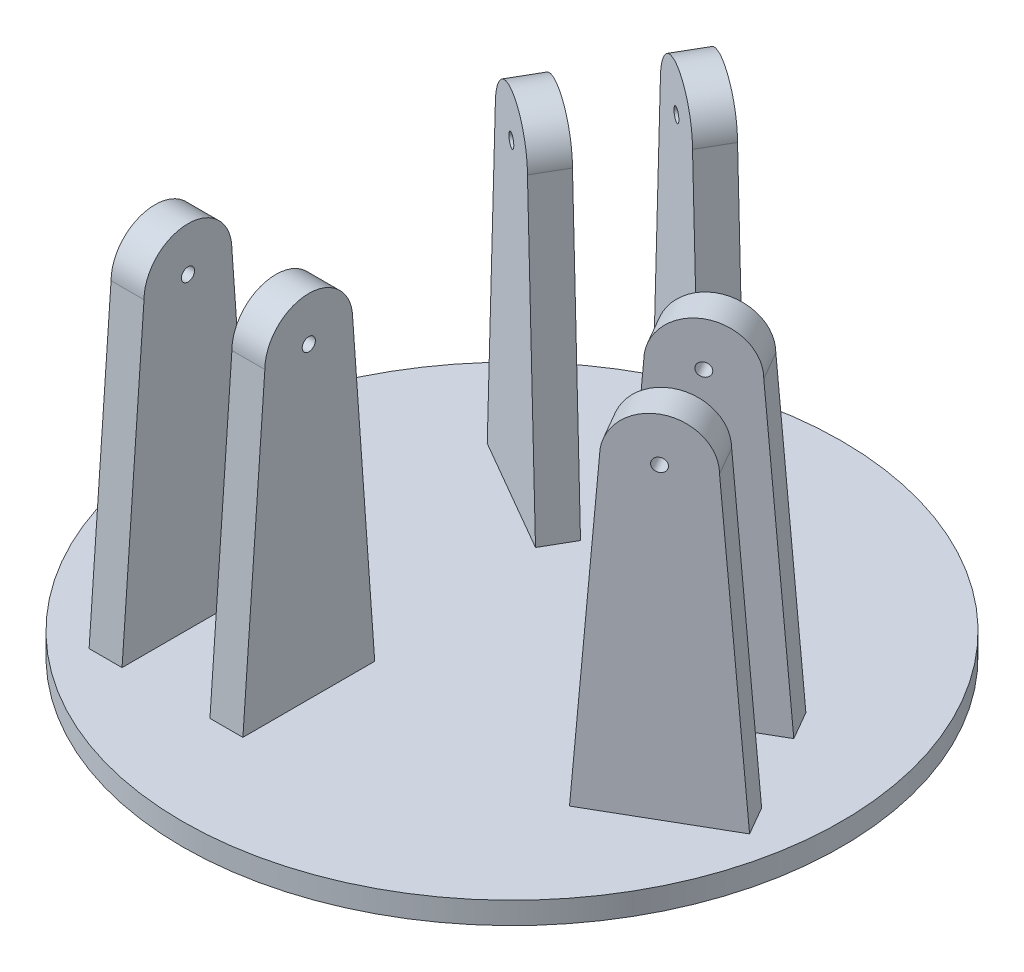
ISO-10303-21;
HEADER;
FILE_DESCRIPTION(('STEP AP214'),'2;1');
FILE_NAME('part.step','',(''),(''),'','','');
FILE_SCHEMA(('AUTOMOTIVE_DESIGN { 1 0 10303 214 1 1 1 1 }'));
ENDSEC;
DATA;
#1=APPLICATION_CONTEXT('core data for automotive mechanical design processes');
#2=APPLICATION_PROTOCOL_DEFINITION('international standard','automotive_design',2000,#1);
#3=PRODUCT_CONTEXT('',#1,'mechanical');
#4=PRODUCT('Part','Part','',(#3));
#5=PRODUCT_RELATED_PRODUCT_CATEGORY('part','',(#4));
#6=PRODUCT_DEFINITION_FORMATION('','',#4);
#7=PRODUCT_DEFINITION_CONTEXT('part definition',#1,'design');
#8=PRODUCT_DEFINITION('design','',#6,#7);
#9=PRODUCT_DEFINITION_SHAPE('','',#8);
#10=(LENGTH_UNIT() NAMED_UNIT(*) SI_UNIT(.MILLI.,.METRE.));
#11=(NAMED_UNIT(*) PLANE_ANGLE_UNIT() SI_UNIT($,.RADIAN.));
#12=(NAMED_UNIT(*) SI_UNIT($,.STERADIAN.) SOLID_ANGLE_UNIT());
#13=UNCERTAINTY_MEASURE_WITH_UNIT(LENGTH_MEASURE(1.E-05),#10,'distance_accuracy_value','');
#14=(GEOMETRIC_REPRESENTATION_CONTEXT(3) GLOBAL_UNCERTAINTY_ASSIGNED_CONTEXT((#13)) GLOBAL_UNIT_ASSIGNED_CONTEXT((#10,
#11,#12)) REPRESENTATION_CONTEXT('',''));
#15=CARTESIAN_POINT('',(0.,0.,0.));
#16=DIRECTION('',(0.,0.,1.));
#17=DIRECTION('',(1.,0.,0.));
#18=AXIS2_PLACEMENT_3D('',#15,#16,#17);
#19=CARTESIAN_POINT('',(0.,5.,0.));
#20=DIRECTION('',(0.,-1.,0.));
#21=DIRECTION('',(0.,0.,-1.));
#22=AXIS2_PLACEMENT_3D('',#19,#20,#21);
#23=CYLINDRICAL_SURFACE('',#22,75.);
#24=CARTESIAN_POINT('',(0.,5.,0.));
#25=DIRECTION('',(0.,1.,0.));
#26=DIRECTION('',(0.,0.,1.));
#27=AXIS2_PLACEMENT_3D('',#24,#25,#26);
#28=CIRCLE('',#27,75.);
#29=CARTESIAN_POINT('',(0.,5.,75.));
#30=VERTEX_POINT('',#29);
#31=EDGE_CURVE('E328',#30,#30,#28,.T.);
#32=ORIENTED_EDGE('',*,*,#31,.F.);
#33=EDGE_LOOP('',(#32));
#34=FACE_BOUND('',#33,.T.);
#35=CARTESIAN_POINT('',(0.,0.,0.));
#36=DIRECTION('',(0.,1.,0.));
#37=DIRECTION('',(0.,0.,1.));
#38=AXIS2_PLACEMENT_3D('',#35,#36,#37);
#39=CIRCLE('',#38,75.);
#40=CARTESIAN_POINT('',(0.,0.,75.));
#41=VERTEX_POINT('',#40);
#42=EDGE_CURVE('E327',#41,#41,#39,.T.);
#43=ORIENTED_EDGE('',*,*,#42,.T.);
#44=EDGE_LOOP('',(#43));
#45=FACE_BOUND('',#44,.T.);
#46=ADVANCED_FACE('F31',(#34,#45),#23,.T.);
#47=CARTESIAN_POINT('',(0.,5.,0.));
#48=DIRECTION('',(0.,1.,0.));
#49=DIRECTION('',(0.,0.,1.));
#50=AXIS2_PLACEMENT_3D('',#47,#48,#49);
#51=PLANE('',#50);
#52=DIRECTION('',(0.499999999999992,0.,-0.866025403784443));
#53=VECTOR('',#52,1.);
#54=CARTESIAN_POINT('',(-44.6471466331836,5.,-25.7770421272167));
#55=LINE('',#54,#53);
#56=CARTESIAN_POINT('',(-26.052503776041,5.,-57.983908304386));
#57=VERTEX_POINT('',#56);
#58=CARTESIAN_POINT('',(-22.3025037760411,5.,-64.4790988327693));
#59=VERTEX_POINT('',#58);
#60=EDGE_CURVE('E221',#57,#59,#55,.T.);
#61=ORIENTED_EDGE('',*,*,#60,.T.);
#62=DIRECTION('',(0.866025403784443,0.,0.499999999999992));
#63=VECTOR('',#62,1.);
#64=CARTESIAN_POINT('',(22.3446428571425,5.,-38.7020567055527));
#65=LINE('',#64,#63);
#66=CARTESIAN_POINT('',(3.67825833749224,5.,-49.4790988327696));
#67=VERTEX_POINT('',#66);
#68=EDGE_CURVE('E217',#59,#67,#65,.T.);
#69=ORIENTED_EDGE('',*,*,#68,.T.);
#70=DIRECTION('',(-0.499999999999992,0.,0.866025403784443));
#71=VECTOR('',#70,1.);
#72=CARTESIAN_POINT('',(-18.6663845196503,5.,-10.7770421272169));
#73=LINE('',#72,#71);
#74=CARTESIAN_POINT('',(-0.0717416625076982,5.,-42.9839083043863));
#75=VERTEX_POINT('',#74);
#76=EDGE_CURVE('E220',#67,#75,#73,.T.);
#77=ORIENTED_EDGE('',*,*,#76,.T.);
#78=DIRECTION('',(-0.866025403784443,0.,-0.499999999999992));
#79=VECTOR('',#78,1.);
#80=CARTESIAN_POINT('',(18.5946428571426,5.,-32.2068661771693));
#81=LINE('',#80,#79);
#82=EDGE_CURVE('E223',#75,#57,#81,.T.);
#83=ORIENTED_EDGE('',*,*,#82,.T.);
#84=EDGE_LOOP('',(#61,#69,#77,#83));
#85=FACE_BOUND('',#84,.T.);
#86=DIRECTION('',(0.499999999999992,0.,-0.866025403784443));
#87=VECTOR('',#86,1.);
#88=CARTESIAN_POINT('',(-44.6471466331836,5.,-25.7770421272167));
#89=LINE('',#88,#87);
#90=CARTESIAN_POINT('',(-39.8025037760408,5.,-34.1682097003138));
#91=VERTEX_POINT('',#90);
#92=CARTESIAN_POINT('',(-36.0525037760408,5.,-40.6634002286972));
#93=VERTEX_POINT('',#92);
#94=EDGE_CURVE('E239',#91,#93,#89,.T.);
#95=ORIENTED_EDGE('',*,*,#94,.T.);
#96=DIRECTION('',(0.866025403784443,0.,0.499999999999992));
#97=VECTOR('',#96,1.);
#98=CARTESIAN_POINT('',(8.59464285714273,5.,-14.8863581014805));
#99=LINE('',#98,#97);
#100=CARTESIAN_POINT('',(-10.0717416625075,5.,-25.6634002286974));
#101=VERTEX_POINT('',#100);
#102=EDGE_CURVE('E231',#93,#101,#99,.T.);
#103=ORIENTED_EDGE('',*,*,#102,.T.);
#104=DIRECTION('',(-0.499999999999992,0.,0.866025403784443));
#105=VECTOR('',#104,1.);
#106=CARTESIAN_POINT('',(-18.6663845196503,5.,-10.7770421272169));
#107=LINE('',#106,#105);
#108=CARTESIAN_POINT('',(-13.8217416625075,5.,-19.1682097003141));
#109=VERTEX_POINT('',#108);
#110=EDGE_CURVE('E234',#101,#109,#107,.T.);
#111=ORIENTED_EDGE('',*,*,#110,.T.);
#112=DIRECTION('',(-0.866025403784443,0.,-0.499999999999992));
#113=VECTOR('',#112,1.);
#114=CARTESIAN_POINT('',(4.84464285714279,5.,-8.39116757309714));
#115=LINE('',#114,#113);
#116=EDGE_CURVE('E236',#109,#91,#115,.T.);
#117=ORIENTED_EDGE('',*,*,#116,.T.);
#118=EDGE_LOOP('',(#95,#103,#111,#117));
#119=FACE_BOUND('',#118,.T.);
#120=ORIENTED_EDGE('',*,*,#31,.T.);
#121=EDGE_LOOP('',(#120));
#122=FACE_BOUND('',#121,.T.);
#123=DIRECTION('',(0.500000000000004,0.,0.866025403784436));
#124=VECTOR('',#123,1.);
#125=CARTESIAN_POINT('',(44.6471466331832,5.,-25.7770421272173));
#126=LINE('',#125,#124);
#127=CARTESIAN_POINT('',(63.2417894903262,5.,6.42982404995179));
#128=VERTEX_POINT('',#127);
#129=CARTESIAN_POINT('',(66.9917894903263,5.,12.9250145783351));
#130=VERTEX_POINT('',#129);
#131=EDGE_CURVE('E242',#128,#130,#126,.T.);
#132=ORIENTED_EDGE('',*,*,#131,.T.);
#133=DIRECTION('',(-0.866025403784436,0.,0.500000000000004));
#134=VECTOR('',#133,1.);
#135=CARTESIAN_POINT('',(22.3446428571431,5.,38.7020567055524));
#136=LINE('',#135,#134);
#137=CARTESIAN_POINT('',(41.0110273767932,5.,27.9250145783352));
#138=VERTEX_POINT('',#137);
#139=EDGE_CURVE('E245',#130,#138,#136,.T.);
#140=ORIENTED_EDGE('',*,*,#139,.T.);
#141=DIRECTION('',(-0.500000000000004,0.,-0.866025403784436));
#142=VECTOR('',#141,1.);
#143=CARTESIAN_POINT('',(18.6663845196501,5.,-10.7770421272172));
#144=LINE('',#143,#142);
#145=CARTESIAN_POINT('',(37.2610273767932,5.,21.4298240499519));
#146=VERTEX_POINT('',#145);
#147=EDGE_CURVE('E248',#138,#146,#144,.T.);
#148=ORIENTED_EDGE('',*,*,#147,.T.);
#149=DIRECTION('',(0.866025403784436,0.,-0.500000000000004));
#150=VECTOR('',#149,1.);
#151=CARTESIAN_POINT('',(18.594642857143,5.,32.2068661771691));
#152=LINE('',#151,#150);
#153=EDGE_CURVE('E251',#146,#128,#152,.T.);
#154=ORIENTED_EDGE('',*,*,#153,.T.);
#155=EDGE_LOOP('',(#132,#140,#148,#154));
#156=FACE_BOUND('',#155,.T.);
#157=DIRECTION('',(0.500000000000004,0.,0.866025403784436));
#158=VECTOR('',#157,1.);
#159=CARTESIAN_POINT('',(44.6471466331832,5.,-25.7770421272173));
#160=LINE('',#159,#158);
#161=CARTESIAN_POINT('',(49.4917894903261,5.,-17.3858745541202));
#162=VERTEX_POINT('',#161);
#163=CARTESIAN_POINT('',(53.2417894903262,5.,-10.8906840257369));
#164=VERTEX_POINT('',#163);
#165=EDGE_CURVE('E262',#162,#164,#160,.T.);
#166=ORIENTED_EDGE('',*,*,#165,.T.);
#167=DIRECTION('',(-0.866025403784436,0.,0.500000000000004));
#168=VECTOR('',#167,1.);
#169=CARTESIAN_POINT('',(8.59464285714294,5.,14.8863581014803));
#170=LINE('',#169,#168);
#171=CARTESIAN_POINT('',(27.2610273767931,5.,4.10931597426317));
#172=VERTEX_POINT('',#171);
#173=EDGE_CURVE('E254',#164,#172,#170,.T.);
#174=ORIENTED_EDGE('',*,*,#173,.T.);
#175=DIRECTION('',(-0.500000000000004,0.,-0.866025403784437));
#176=VECTOR('',#175,1.);
#177=CARTESIAN_POINT('',(18.6663845196501,5.,-10.7770421272172));
#178=LINE('',#177,#176);
#179=CARTESIAN_POINT('',(23.511027376793,5.,-2.38587455412011));
#180=VERTEX_POINT('',#179);
#181=EDGE_CURVE('E257',#172,#180,#178,.T.);
#182=ORIENTED_EDGE('',*,*,#181,.T.);
#183=DIRECTION('',(0.866025403784436,0.,-0.500000000000004));
#184=VECTOR('',#183,1.);
#185=CARTESIAN_POINT('',(4.84464285714291,5.,8.39116757309708));
#186=LINE('',#185,#184);
#187=EDGE_CURVE('E259',#180,#162,#186,.T.);
#188=ORIENTED_EDGE('',*,*,#187,.T.);
#189=EDGE_LOOP('',(#166,#174,#182,#188));
#190=FACE_BOUND('',#189,.T.);
#191=DIRECTION('',(-1.,0.,0.));
#192=VECTOR('',#191,1.);
#193=CARTESIAN_POINT('',(0.,5.,51.5540842544342));
#194=LINE('',#193,#192);
#195=CARTESIAN_POINT('',(-37.1892857142858,5.,51.5540842544342));
#196=VERTEX_POINT('',#195);
#197=CARTESIAN_POINT('',(-44.6892857142858,5.,51.5540842544342));
#198=VERTEX_POINT('',#197);
#199=EDGE_CURVE('E303',#196,#198,#194,.T.);
#200=ORIENTED_EDGE('',*,*,#199,.T.);
#201=DIRECTION('',(0.,0.,-1.));
#202=VECTOR('',#201,1.);
#203=CARTESIAN_POINT('',(-44.6892857142858,5.,0.));
#204=LINE('',#203,#202);
#205=CARTESIAN_POINT('',(-44.6892857142858,5.,21.5540842544342));
#206=VERTEX_POINT('',#205);
#207=EDGE_CURVE('E306',#198,#206,#204,.T.);
#208=ORIENTED_EDGE('',*,*,#207,.T.);
#209=DIRECTION('',(1.,0.,0.));
#210=VECTOR('',#209,1.);
#211=CARTESIAN_POINT('',(0.,5.,21.5540842544342));
#212=LINE('',#211,#210);
#213=CARTESIAN_POINT('',(-37.1892857142858,5.,21.5540842544342));
#214=VERTEX_POINT('',#213);
#215=EDGE_CURVE('E309',#206,#214,#212,.T.);
#216=ORIENTED_EDGE('',*,*,#215,.T.);
#217=DIRECTION('',(0.,0.,1.));
#218=VECTOR('',#217,1.);
#219=CARTESIAN_POINT('',(-37.1892857142858,5.,0.));
#220=LINE('',#219,#218);
#221=EDGE_CURVE('E312',#214,#196,#220,.T.);
#222=ORIENTED_EDGE('',*,*,#221,.T.);
#223=EDGE_LOOP('',(#200,#208,#216,#222));
#224=FACE_BOUND('',#223,.T.);
#225=DIRECTION('',(-1.,0.,0.));
#226=VECTOR('',#225,1.);
#227=CARTESIAN_POINT('',(0.,5.,51.5540842544342));
#228=LINE('',#227,#226);
#229=CARTESIAN_POINT('',(-9.68928571428573,5.,51.5540842544342));
#230=VERTEX_POINT('',#229);
#231=CARTESIAN_POINT('',(-17.1892857142857,5.,51.5540842544342));
#232=VERTEX_POINT('',#231);
#233=EDGE_CURVE('E324',#230,#232,#228,.T.);
#234=ORIENTED_EDGE('',*,*,#233,.T.);
#235=DIRECTION('',(0.,0.,-1.));
#236=VECTOR('',#235,1.);
#237=CARTESIAN_POINT('',(-17.1892857142857,5.,0.));
#238=LINE('',#237,#236);
#239=CARTESIAN_POINT('',(-17.1892857142857,5.,21.5540842544342));
#240=VERTEX_POINT('',#239);
#241=EDGE_CURVE('E315',#232,#240,#238,.T.);
#242=ORIENTED_EDGE('',*,*,#241,.T.);
#243=DIRECTION('',(1.,0.,0.));
#244=VECTOR('',#243,1.);
#245=CARTESIAN_POINT('',(0.,5.,21.5540842544342));
#246=LINE('',#245,#244);
#247=CARTESIAN_POINT('',(-9.68928571428573,5.,21.5540842544342));
#248=VERTEX_POINT('',#247);
#249=EDGE_CURVE('E318',#240,#248,#246,.T.);
#250=ORIENTED_EDGE('',*,*,#249,.T.);
#251=DIRECTION('',(0.,0.,1.));
#252=VECTOR('',#251,1.);
#253=CARTESIAN_POINT('',(-9.68928571428573,5.,0.));
#254=LINE('',#253,#252);
#255=EDGE_CURVE('E321',#248,#230,#254,.T.);
#256=ORIENTED_EDGE('',*,*,#255,.T.);
#257=EDGE_LOOP('',(#234,#242,#250,#256));
#258=FACE_BOUND('',#257,.T.);
#259=ADVANCED_FACE('F353',(#85,#119,#122,#156,#190,#224,#258),#51,.T.);
#260=CARTESIAN_POINT('',(0.,0.,0.));
#261=DIRECTION('',(0.,1.,0.));
#262=DIRECTION('',(0.,0.,1.));
#263=AXIS2_PLACEMENT_3D('',#260,#261,#262);
#264=PLANE('',#263);
#265=ORIENTED_EDGE('',*,*,#42,.F.);
#266=EDGE_LOOP('',(#265));
#267=FACE_BOUND('',#266,.T.);
#268=ADVANCED_FACE('F437',(#267),#264,.F.);
#269=CARTESIAN_POINT('',(-17.1892857142857,85.,0.));
#270=DIRECTION('',(-1.,0.,0.));
#271=DIRECTION('',(0.,0.,1.));
#272=AXIS2_PLACEMENT_3D('',#269,#270,#271);
#273=PLANE('',#272);
#274=CARTESIAN_POINT('',(-17.1892857142857,75.,36.5540842544342));
#275=DIRECTION('',(-1.,0.,0.));
#276=DIRECTION('',(0.,0.,1.));
#277=AXIS2_PLACEMENT_3D('',#274,#275,#276);
#278=CIRCLE('',#277,1.5);
#279=CARTESIAN_POINT('',(-17.1892857142857,75.,38.0540842544342));
#280=VERTEX_POINT('',#279);
#281=EDGE_CURVE('E272',#280,#280,#278,.T.);
#282=ORIENTED_EDGE('',*,*,#281,.F.);
#283=EDGE_LOOP('',(#282));
#284=FACE_BOUND('',#283,.T.);
#285=DIRECTION('',(0.,-0.997458699830735,0.0712470499879097));
#286=VECTOR('',#285,1.);
#287=CARTESIAN_POINT('',(-17.1892857142857,88.2576506576755,45.6071092074574));
#288=LINE('',#287,#286);
#289=CARTESIAN_POINT('',(-17.1892857142857,75.,46.5540842544342));
#290=VERTEX_POINT('',#289);
#291=EDGE_CURVE('E301',#290,#232,#288,.T.);
#292=ORIENTED_EDGE('',*,*,#291,.F.);
#293=CARTESIAN_POINT('',(-17.1892857142857,75.,36.5540842544342));
#294=DIRECTION('',(-1.,0.,0.));
#295=DIRECTION('',(0.,0.,1.));
#296=AXIS2_PLACEMENT_3D('',#293,#294,#295);
#297=CIRCLE('',#296,9.99999999999999);
#298=CARTESIAN_POINT('',(-17.1892857142857,75.,26.5540842544342));
#299=VERTEX_POINT('',#298);
#300=EDGE_CURVE('E289',#299,#290,#297,.F.);
#301=ORIENTED_EDGE('',*,*,#300,.F.);
#302=DIRECTION('',(0.,0.997458699830735,0.0712470499879097));
#303=VECTOR('',#302,1.);
#304=CARTESIAN_POINT('',(-17.1892857142857,83.0621462966392,27.1299518470513));
#305=LINE('',#304,#303);
#306=EDGE_CURVE('E295',#240,#299,#305,.T.);
#307=ORIENTED_EDGE('',*,*,#306,.F.);
#308=ORIENTED_EDGE('',*,*,#241,.F.);
#309=EDGE_LOOP('',(#292,#301,#307,#308));
#310=FACE_BOUND('',#309,.T.);
#311=ADVANCED_FACE('F444',(#284,#310),#273,.T.);
#312=CARTESIAN_POINT('',(-9.68928571428573,85.,0.));
#313=DIRECTION('',(1.,0.,0.));
#314=DIRECTION('',(0.,0.,-1.));
#315=AXIS2_PLACEMENT_3D('',#312,#313,#314);
#316=PLANE('',#315);
#317=CARTESIAN_POINT('',(-9.68928571428573,75.,36.5540842544342));
#318=DIRECTION('',(1.,0.,0.));
#319=DIRECTION('',(0.,0.,-1.));
#320=AXIS2_PLACEMENT_3D('',#317,#318,#319);
#321=CIRCLE('',#320,1.5);
#322=CARTESIAN_POINT('',(-9.68928571428573,75.,35.0540842544342));
#323=VERTEX_POINT('',#322);
#324=EDGE_CURVE('E269',#323,#323,#321,.T.);
#325=ORIENTED_EDGE('',*,*,#324,.F.);
#326=EDGE_LOOP('',(#325));
#327=FACE_BOUND('',#326,.T.);
#328=DIRECTION('',(0.,0.997458699830735,-0.0712470499879097));
#329=VECTOR('',#328,1.);
#330=CARTESIAN_POINT('',(-9.68928571428573,88.2576506576755,45.6071092074574));
#331=LINE('',#330,#329);
#332=CARTESIAN_POINT('',(-9.68928571428573,75.,46.5540842544342));
#333=VERTEX_POINT('',#332);
#334=EDGE_CURVE('E299',#230,#333,#331,.T.);
#335=ORIENTED_EDGE('',*,*,#334,.F.);
#336=ORIENTED_EDGE('',*,*,#255,.F.);
#337=DIRECTION('',(0.,-0.997458699830735,-0.0712470499879097));
#338=VECTOR('',#337,1.);
#339=CARTESIAN_POINT('',(-9.68928571428573,83.0621462966392,27.1299518470513));
#340=LINE('',#339,#338);
#341=CARTESIAN_POINT('',(-9.68928571428573,75.,26.5540842544342));
#342=VERTEX_POINT('',#341);
#343=EDGE_CURVE('E293',#342,#248,#340,.T.);
#344=ORIENTED_EDGE('',*,*,#343,.F.);
#345=CARTESIAN_POINT('',(-9.68928571428573,75.,36.5540842544342));
#346=DIRECTION('',(1.,0.,0.));
#347=DIRECTION('',(0.,0.,-1.));
#348=AXIS2_PLACEMENT_3D('',#345,#346,#347);
#349=CIRCLE('',#348,9.99999999999999);
#350=EDGE_CURVE('E287',#333,#342,#349,.F.);
#351=ORIENTED_EDGE('',*,*,#350,.F.);
#352=EDGE_LOOP('',(#335,#336,#344,#351));
#353=FACE_BOUND('',#352,.T.);
#354=ADVANCED_FACE('F448',(#327,#353),#316,.T.);
#355=CARTESIAN_POINT('',(-37.1892857142858,85.,0.));
#356=DIRECTION('',(1.,0.,0.));
#357=DIRECTION('',(0.,0.,-1.));
#358=AXIS2_PLACEMENT_3D('',#355,#356,#357);
#359=PLANE('',#358);
#360=CARTESIAN_POINT('',(-37.1892857142858,75.,36.5540842544342));
#361=DIRECTION('',(1.,0.,0.));
#362=DIRECTION('',(0.,0.,-1.));
#363=AXIS2_PLACEMENT_3D('',#360,#361,#362);
#364=CIRCLE('',#363,1.5);
#365=CARTESIAN_POINT('',(-37.1892857142858,75.,35.0540842544342));
#366=VERTEX_POINT('',#365);
#367=EDGE_CURVE('E266',#366,#366,#364,.T.);
#368=ORIENTED_EDGE('',*,*,#367,.F.);
#369=EDGE_LOOP('',(#368));
#370=FACE_BOUND('',#369,.T.);
#371=DIRECTION('',(0.,0.997458699830735,-0.0712470499879097));
#372=VECTOR('',#371,1.);
#373=CARTESIAN_POINT('',(-37.1892857142858,88.2576506576755,45.6071092074574));
#374=LINE('',#373,#372);
#375=CARTESIAN_POINT('',(-37.1892857142858,75.,46.5540842544342));
#376=VERTEX_POINT('',#375);
#377=EDGE_CURVE('E297',#196,#376,#374,.T.);
#378=ORIENTED_EDGE('',*,*,#377,.F.);
#379=ORIENTED_EDGE('',*,*,#221,.F.);
#380=DIRECTION('',(0.,-0.997458699830735,-0.0712470499879097));
#381=VECTOR('',#380,1.);
#382=CARTESIAN_POINT('',(-37.1892857142858,83.0621462966392,27.1299518470513));
#383=LINE('',#382,#381);
#384=CARTESIAN_POINT('',(-37.1892857142858,75.,26.5540842544342));
#385=VERTEX_POINT('',#384);
#386=EDGE_CURVE('E291',#385,#214,#383,.T.);
#387=ORIENTED_EDGE('',*,*,#386,.F.);
#388=CARTESIAN_POINT('',(-37.1892857142858,75.,36.5540842544342));
#389=DIRECTION('',(1.,0.,0.));
#390=DIRECTION('',(0.,0.,-1.));
#391=AXIS2_PLACEMENT_3D('',#388,#389,#390);
#392=CIRCLE('',#391,9.99999999999999);
#393=EDGE_CURVE('E285',#376,#385,#392,.F.);
#394=ORIENTED_EDGE('',*,*,#393,.F.);
#395=EDGE_LOOP('',(#378,#379,#387,#394));
#396=FACE_BOUND('',#395,.T.);
#397=ADVANCED_FACE('F454',(#370,#396),#359,.T.);
#398=CARTESIAN_POINT('',(-44.6892857142858,85.,0.));
#399=DIRECTION('',(-1.,0.,0.));
#400=DIRECTION('',(0.,0.,1.));
#401=AXIS2_PLACEMENT_3D('',#398,#399,#400);
#402=PLANE('',#401);
#403=CARTESIAN_POINT('',(-44.6892857142858,75.,36.5540842544342));
#404=DIRECTION('',(-1.,0.,0.));
#405=DIRECTION('',(0.,0.,1.));
#406=AXIS2_PLACEMENT_3D('',#403,#404,#405);
#407=CIRCLE('',#406,1.5);
#408=CARTESIAN_POINT('',(-44.6892857142858,75.,38.0540842544342));
#409=VERTEX_POINT('',#408);
#410=EDGE_CURVE('E265',#409,#409,#407,.T.);
#411=ORIENTED_EDGE('',*,*,#410,.F.);
#412=EDGE_LOOP('',(#411));
#413=FACE_BOUND('',#412,.T.);
#414=DIRECTION('',(0.,-0.997458699830735,0.0712470499879097));
#415=VECTOR('',#414,1.);
#416=CARTESIAN_POINT('',(-44.6892857142858,88.2576506576755,45.6071092074574));
#417=LINE('',#416,#415);
#418=CARTESIAN_POINT('',(-44.6892857142858,75.,46.5540842544342));
#419=VERTEX_POINT('',#418);
#420=EDGE_CURVE('E335',#419,#198,#417,.T.);
#421=ORIENTED_EDGE('',*,*,#420,.F.);
#422=CARTESIAN_POINT('',(-44.6892857142858,75.,36.5540842544342));
#423=DIRECTION('',(-1.,0.,0.));
#424=DIRECTION('',(0.,0.,1.));
#425=AXIS2_PLACEMENT_3D('',#422,#423,#424);
#426=CIRCLE('',#425,9.99999999999999);
#427=CARTESIAN_POINT('',(-44.6892857142858,75.,26.5540842544342));
#428=VERTEX_POINT('',#427);
#429=EDGE_CURVE('E283',#428,#419,#426,.F.);
#430=ORIENTED_EDGE('',*,*,#429,.F.);
#431=DIRECTION('',(0.,0.997458699830735,0.0712470499879097));
#432=VECTOR('',#431,1.);
#433=CARTESIAN_POINT('',(-44.6892857142858,83.0621462966392,27.1299518470513));
#434=LINE('',#433,#432);
#435=EDGE_CURVE('E331',#206,#428,#434,.T.);
#436=ORIENTED_EDGE('',*,*,#435,.F.);
#437=ORIENTED_EDGE('',*,*,#207,.F.);
#438=EDGE_LOOP('',(#421,#430,#436,#437));
#439=FACE_BOUND('',#438,.T.);
#440=ADVANCED_FACE('F456',(#413,#439),#402,.T.);
#441=CARTESIAN_POINT('',(-55.,75.,36.5540842544342));
#442=DIRECTION('',(1.,0.,0.));
#443=DIRECTION('',(0.,0.,-1.));
#444=AXIS2_PLACEMENT_3D('',#441,#442,#443);
#445=CYLINDRICAL_SURFACE('',#444,9.99999999999999);
#446=ORIENTED_EDGE('',*,*,#393,.T.);
#447=DIRECTION('',(1.,0.,0.));
#448=VECTOR('',#447,1.);
#449=CARTESIAN_POINT('',(-55.,75.,26.5540842544342));
#450=LINE('',#449,#448);
#451=EDGE_CURVE('E279',#428,#385,#450,.T.);
#452=ORIENTED_EDGE('',*,*,#451,.F.);
#453=ORIENTED_EDGE('',*,*,#429,.T.);
#454=DIRECTION('',(1.,0.,0.));
#455=VECTOR('',#454,1.);
#456=CARTESIAN_POINT('',(-55.,75.,46.5540842544342));
#457=LINE('',#456,#455);
#458=EDGE_CURVE('E280',#419,#376,#457,.T.);
#459=ORIENTED_EDGE('',*,*,#458,.T.);
#460=EDGE_LOOP('',(#446,#452,#453,#459));
#461=FACE_BOUND('',#460,.T.);
#462=ADVANCED_FACE('F459',(#461),#445,.T.);
#463=CARTESIAN_POINT('',(-55.,5.,21.5540842544342));
#464=DIRECTION('',(0.,-0.0712470499879097,0.997458699830735));
#465=DIRECTION('',(0.,-0.997458699830735,-0.0712470499879097));
#466=AXIS2_PLACEMENT_3D('',#463,#464,#465);
#467=PLANE('',#466);
#468=ORIENTED_EDGE('',*,*,#386,.T.);
#469=ORIENTED_EDGE('',*,*,#215,.F.);
#470=ORIENTED_EDGE('',*,*,#435,.T.);
#471=ORIENTED_EDGE('',*,*,#451,.T.);
#472=EDGE_LOOP('',(#468,#469,#470,#471));
#473=FACE_BOUND('',#472,.T.);
#474=ADVANCED_FACE('F468',(#473),#467,.F.);
#475=CARTESIAN_POINT('',(-55.,5.,51.5540842544342));
#476=DIRECTION('',(0.,-0.0712470499879097,-0.997458699830735));
#477=DIRECTION('',(0.,0.997458699830735,-0.0712470499879097));
#478=AXIS2_PLACEMENT_3D('',#475,#476,#477);
#479=PLANE('',#478);
#480=ORIENTED_EDGE('',*,*,#377,.T.);
#481=ORIENTED_EDGE('',*,*,#458,.F.);
#482=ORIENTED_EDGE('',*,*,#420,.T.);
#483=ORIENTED_EDGE('',*,*,#199,.F.);
#484=EDGE_LOOP('',(#480,#481,#482,#483));
#485=FACE_BOUND('',#484,.T.);
#486=ADVANCED_FACE('F464',(#485),#479,.F.);
#487=ORIENTED_EDGE('',*,*,#291,.T.);
#488=ORIENTED_EDGE('',*,*,#233,.F.);
#489=ORIENTED_EDGE('',*,*,#334,.T.);
#490=EDGE_CURVE('E275',#290,#333,#457,.T.);
#491=ORIENTED_EDGE('',*,*,#490,.F.);
#492=EDGE_LOOP('',(#487,#488,#489,#491));
#493=FACE_BOUND('',#492,.T.);
#494=ADVANCED_FACE('F467',(#493),#479,.F.);
#495=ORIENTED_EDGE('',*,*,#306,.T.);
#496=EDGE_CURVE('E276',#299,#342,#450,.T.);
#497=ORIENTED_EDGE('',*,*,#496,.T.);
#498=ORIENTED_EDGE('',*,*,#343,.T.);
#499=ORIENTED_EDGE('',*,*,#249,.F.);
#500=EDGE_LOOP('',(#495,#497,#498,#499));
#501=FACE_BOUND('',#500,.T.);
#502=ADVANCED_FACE('F474',(#501),#467,.F.);
#503=ORIENTED_EDGE('',*,*,#300,.T.);
#504=ORIENTED_EDGE('',*,*,#490,.T.);
#505=ORIENTED_EDGE('',*,*,#350,.T.);
#506=ORIENTED_EDGE('',*,*,#496,.F.);
#507=EDGE_LOOP('',(#503,#504,#505,#506));
#508=FACE_BOUND('',#507,.T.);
#509=ADVANCED_FACE('F470',(#508),#445,.T.);
#510=CARTESIAN_POINT('',(-55.,75.,36.5540842544342));
#511=DIRECTION('',(1.,0.,0.));
#512=DIRECTION('',(0.,0.,-1.));
#513=AXIS2_PLACEMENT_3D('',#510,#511,#512);
#514=CYLINDRICAL_SURFACE('',#513,1.5);
#515=ORIENTED_EDGE('',*,*,#367,.T.);
#516=EDGE_LOOP('',(#515));
#517=FACE_BOUND('',#516,.T.);
#518=ORIENTED_EDGE('',*,*,#410,.T.);
#519=EDGE_LOOP('',(#518));
#520=FACE_BOUND('',#519,.T.);
#521=ADVANCED_FACE('F473',(#517,#520),#514,.F.);
#522=ORIENTED_EDGE('',*,*,#281,.T.);
#523=EDGE_LOOP('',(#522));
#524=FACE_BOUND('',#523,.T.);
#525=ORIENTED_EDGE('',*,*,#324,.T.);
#526=EDGE_LOOP('',(#525));
#527=FACE_BOUND('',#526,.T.);
#528=ADVANCED_FACE('F427',(#524,#527),#514,.F.);
#529=CARTESIAN_POINT('',(8.59464285714294,85.,14.8863581014803));
#530=DIRECTION('',(0.500000000000004,0.,0.866025403784436));
#531=DIRECTION('',(0.866025403784436,0.,-0.500000000000004));
#532=AXIS2_PLACEMENT_3D('',#529,#530,#531);
#533=PLANE('',#532);
#534=CARTESIAN_POINT('',(40.2514084335596,75.,-3.39068402573688));
#535=DIRECTION('',(0.500000000000004,0.,0.866025403784436));
#536=DIRECTION('',(0.866025403784436,0.,-0.500000000000004));
#537=AXIS2_PLACEMENT_3D('',#534,#535,#536);
#538=CIRCLE('',#537,1.5);
#539=CARTESIAN_POINT('',(41.5504465392363,75.,-4.14068402573689));
#540=VERTEX_POINT('',#539);
#541=EDGE_CURVE('E370',#540,#540,#538,.T.);
#542=ORIENTED_EDGE('',*,*,#541,.F.);
#543=EDGE_LOOP('',(#542));
#544=FACE_BOUND('',#543,.T.);
#545=DIRECTION('',(0.0617017552342294,-0.997458699830735,-0.0356235249939551));
#546=VECTOR('',#545,1.);
#547=CARTESIAN_POINT('',(48.0915580239721,88.2576506576755,-7.91719650224852));
#548=LINE('',#547,#546);
#549=CARTESIAN_POINT('',(48.911662471404,75.,-8.39068402573692));
#550=VERTEX_POINT('',#549);
#551=EDGE_CURVE('E225',#550,#164,#548,.T.);
#552=ORIENTED_EDGE('',*,*,#551,.F.);
#553=CARTESIAN_POINT('',(40.2514084335596,75.,-3.39068402573688));
#554=DIRECTION('',(0.500000000000004,0.,0.866025403784436));
#555=DIRECTION('',(0.866025403784436,0.,-0.500000000000004));
#556=AXIS2_PLACEMENT_3D('',#553,#554,#555);
#557=CIRCLE('',#556,9.99999999999999);
#558=CARTESIAN_POINT('',(31.5911543957153,75.,1.60931597426315));
#559=VERTEX_POINT('',#558);
#560=EDGE_CURVE('E386',#559,#550,#557,.F.);
#561=ORIENTED_EDGE('',*,*,#560,.F.);
#562=DIRECTION('',(0.0617017552342294,0.997458699830735,-0.0356235249939551));
#563=VECTOR('',#562,1.);
#564=CARTESIAN_POINT('',(32.0898703601378,83.0621462966392,1.3213821779546));
#565=LINE('',#564,#563);
#566=EDGE_CURVE('E391',#172,#559,#565,.T.);
#567=ORIENTED_EDGE('',*,*,#566,.F.);
#568=ORIENTED_EDGE('',*,*,#173,.F.);
#569=EDGE_LOOP('',(#552,#561,#567,#568));
#570=FACE_BOUND('',#569,.T.);
#571=ADVANCED_FACE('F408',(#544,#570),#533,.T.);
#572=CARTESIAN_POINT('',(4.84464285714291,85.,8.39116757309708));
#573=DIRECTION('',(-0.500000000000004,0.,-0.866025403784436));
#574=DIRECTION('',(-0.866025403784436,0.,0.500000000000004));
#575=AXIS2_PLACEMENT_3D('',#572,#573,#574);
#576=PLANE('',#575);
#577=CARTESIAN_POINT('',(36.5014084335596,75.,-9.88587455412016));
#578=DIRECTION('',(-0.500000000000004,0.,-0.866025403784436));
#579=DIRECTION('',(-0.866025403784436,0.,0.500000000000004));
#580=AXIS2_PLACEMENT_3D('',#577,#578,#579);
#581=CIRCLE('',#580,1.5);
#582=CARTESIAN_POINT('',(35.2023703278829,75.,-9.13587455412016));
#583=VERTEX_POINT('',#582);
#584=EDGE_CURVE('E367',#583,#583,#581,.T.);
#585=ORIENTED_EDGE('',*,*,#584,.F.);
#586=EDGE_LOOP('',(#585));
#587=FACE_BOUND('',#586,.T.);
#588=DIRECTION('',(-0.0617017552342294,0.997458699830735,0.0356235249939551));
#589=VECTOR('',#588,1.);
#590=CARTESIAN_POINT('',(44.3415580239721,88.2576506576755,-14.4123870306318));
#591=LINE('',#590,#589);
#592=CARTESIAN_POINT('',(45.1616624714039,75.,-14.8858745541202));
#593=VERTEX_POINT('',#592);
#594=EDGE_CURVE('E395',#162,#593,#591,.T.);
#595=ORIENTED_EDGE('',*,*,#594,.F.);
#596=ORIENTED_EDGE('',*,*,#187,.F.);
#597=DIRECTION('',(-0.0617017552342294,-0.997458699830735,0.0356235249939551));
#598=VECTOR('',#597,1.);
#599=CARTESIAN_POINT('',(28.3398703601378,83.0621462966392,-5.17380835042867));
#600=LINE('',#599,#598);
#601=CARTESIAN_POINT('',(27.8411543957152,75.,-4.88587455412013));
#602=VERTEX_POINT('',#601);
#603=EDGE_CURVE('E54',#602,#180,#600,.T.);
#604=ORIENTED_EDGE('',*,*,#603,.F.);
#605=CARTESIAN_POINT('',(36.5014084335596,75.,-9.88587455412016));
#606=DIRECTION('',(-0.500000000000004,0.,-0.866025403784436));
#607=DIRECTION('',(-0.866025403784436,0.,0.500000000000004));
#608=AXIS2_PLACEMENT_3D('',#605,#606,#607);
#609=CIRCLE('',#608,9.99999999999999);
#610=EDGE_CURVE('E384',#593,#602,#609,.F.);
#611=ORIENTED_EDGE('',*,*,#610,.F.);
#612=EDGE_LOOP('',(#595,#596,#604,#611));
#613=FACE_BOUND('',#612,.T.);
#614=ADVANCED_FACE('F415',(#587,#613),#576,.T.);
#615=CARTESIAN_POINT('',(18.594642857143,85.,32.2068661771691));
#616=DIRECTION('',(-0.500000000000004,0.,-0.866025403784436));
#617=DIRECTION('',(-0.866025403784436,0.,0.500000000000004));
#618=AXIS2_PLACEMENT_3D('',#615,#616,#617);
#619=PLANE('',#618);
#620=CARTESIAN_POINT('',(50.2514084335597,75.,13.9298240499519));
#621=DIRECTION('',(-0.500000000000004,0.,-0.866025403784436));
#622=DIRECTION('',(-0.866025403784436,0.,0.500000000000004));
#623=AXIS2_PLACEMENT_3D('',#620,#621,#622);
#624=CIRCLE('',#623,1.5);
#625=CARTESIAN_POINT('',(48.952370327883,75.,14.6798240499519));
#626=VERTEX_POINT('',#625);
#627=EDGE_CURVE('E346',#626,#626,#624,.T.);
#628=ORIENTED_EDGE('',*,*,#627,.F.);
#629=EDGE_LOOP('',(#628));
#630=FACE_BOUND('',#629,.T.);
#631=DIRECTION('',(-0.0617017552342294,0.997458699830735,0.0356235249939551));
#632=VECTOR('',#631,1.);
#633=CARTESIAN_POINT('',(58.0915580239722,88.2576506576755,9.40331157344023));
#634=LINE('',#633,#632);
#635=CARTESIAN_POINT('',(58.9116624714041,75.,8.92982404995182));
#636=VERTEX_POINT('',#635);
#637=EDGE_CURVE('E393',#128,#636,#634,.T.);
#638=ORIENTED_EDGE('',*,*,#637,.F.);
#639=ORIENTED_EDGE('',*,*,#153,.F.);
#640=DIRECTION('',(-0.0617017552342294,-0.997458699830735,0.0356235249939551));
#641=VECTOR('',#640,1.);
#642=CARTESIAN_POINT('',(42.0898703601379,83.0621462966392,18.6418902536433));
#643=LINE('',#642,#641);
#644=CARTESIAN_POINT('',(41.5911543957153,75.,18.9298240499519));
#645=VERTEX_POINT('',#644);
#646=EDGE_CURVE('E388',#645,#146,#643,.T.);
#647=ORIENTED_EDGE('',*,*,#646,.F.);
#648=CARTESIAN_POINT('',(50.2514084335597,75.,13.9298240499519));
#649=DIRECTION('',(-0.500000000000004,0.,-0.866025403784436));
#650=DIRECTION('',(-0.866025403784436,0.,0.500000000000004));
#651=AXIS2_PLACEMENT_3D('',#648,#649,#650);
#652=CIRCLE('',#651,9.99999999999999);
#653=EDGE_CURVE('E382',#636,#645,#652,.F.);
#654=ORIENTED_EDGE('',*,*,#653,.F.);
#655=EDGE_LOOP('',(#638,#639,#647,#654));
#656=FACE_BOUND('',#655,.T.);
#657=ADVANCED_FACE('F417',(#630,#656),#619,.T.);
#658=CARTESIAN_POINT('',(22.3446428571431,85.,38.7020567055524));
#659=DIRECTION('',(0.500000000000004,0.,0.866025403784436));
#660=DIRECTION('',(0.866025403784436,0.,-0.500000000000004));
#661=AXIS2_PLACEMENT_3D('',#658,#659,#660);
#662=PLANE('',#661);
#663=CARTESIAN_POINT('',(54.0014084335597,75.,20.4250145783351));
#664=DIRECTION('',(0.500000000000004,0.,0.866025403784436));
#665=DIRECTION('',(0.866025403784436,0.,-0.500000000000004));
#666=AXIS2_PLACEMENT_3D('',#663,#664,#665);
#667=CIRCLE('',#666,1.5);
#668=CARTESIAN_POINT('',(55.3004465392364,75.,19.6750145783351));
#669=VERTEX_POINT('',#668);
#670=EDGE_CURVE('E343',#669,#669,#667,.T.);
#671=ORIENTED_EDGE('',*,*,#670,.F.);
#672=EDGE_LOOP('',(#671));
#673=FACE_BOUND('',#672,.T.);
#674=DIRECTION('',(0.0617017552342294,-0.997458699830735,-0.0356235249939551));
#675=VECTOR('',#674,1.);
#676=CARTESIAN_POINT('',(61.8415580239722,88.2576506576755,15.8985021018235));
#677=LINE('',#676,#675);
#678=CARTESIAN_POINT('',(62.6616624714041,75.,15.4250145783351));
#679=VERTEX_POINT('',#678);
#680=EDGE_CURVE('E341',#679,#130,#677,.T.);
#681=ORIENTED_EDGE('',*,*,#680,.F.);
#682=CARTESIAN_POINT('',(54.0014084335597,75.,20.4250145783351));
#683=DIRECTION('',(0.500000000000004,0.,0.866025403784436));
#684=DIRECTION('',(0.866025403784436,0.,-0.500000000000004));
#685=AXIS2_PLACEMENT_3D('',#682,#683,#684);
#686=CIRCLE('',#685,9.99999999999999);
#687=CARTESIAN_POINT('',(45.3411543957154,75.,25.4250145783352));
#688=VERTEX_POINT('',#687);
#689=EDGE_CURVE('E380',#688,#679,#686,.F.);
#690=ORIENTED_EDGE('',*,*,#689,.F.);
#691=DIRECTION('',(0.0617017552342294,0.997458699830735,-0.0356235249939551));
#692=VECTOR('',#691,1.);
#693=CARTESIAN_POINT('',(45.839870360138,83.0621462966392,25.1370807820266));
#694=LINE('',#693,#692);
#695=EDGE_CURVE('E337',#138,#688,#694,.T.);
#696=ORIENTED_EDGE('',*,*,#695,.F.);
#697=ORIENTED_EDGE('',*,*,#139,.F.);
#698=EDGE_LOOP('',(#681,#690,#696,#697));
#699=FACE_BOUND('',#698,.T.);
#700=ADVANCED_FACE('F424',(#673,#699),#662,.T.);
#701=CARTESIAN_POINT('',(8.59464285714273,85.,-14.8863581014805));
#702=DIRECTION('',(0.499999999999992,0.,-0.866025403784443));
#703=DIRECTION('',(-0.866025403784443,0.,-0.499999999999992));
#704=AXIS2_PLACEMENT_3D('',#701,#702,#703);
#705=PLANE('',#704);
#706=CARTESIAN_POINT('',(-23.0621227192742,75.,-33.1634002286973));
#707=DIRECTION('',(0.499999999999992,0.,-0.866025403784443));
#708=DIRECTION('',(-0.866025403784443,0.,-0.499999999999992));
#709=AXIS2_PLACEMENT_3D('',#706,#707,#708);
#710=CIRCLE('',#709,1.5);
#711=CARTESIAN_POINT('',(-24.3611608249509,75.,-33.9134002286972));
#712=VERTEX_POINT('',#711);
#713=EDGE_CURVE('E762',#712,#712,#710,.T.);
#714=ORIENTED_EDGE('',*,*,#713,.F.);
#715=EDGE_LOOP('',(#714));
#716=FACE_BOUND('',#715,.T.);
#717=DIRECTION('',(-0.0617017552342299,-0.997458699830735,-0.0356235249939543));
#718=VECTOR('',#717,1.);
#719=CARTESIAN_POINT('',(-30.9022723096867,88.2576506576755,-37.6899127052088));
#720=LINE('',#719,#718);
#721=CARTESIAN_POINT('',(-31.7223767571186,75.,-38.1634002286972));
#722=VERTEX_POINT('',#721);
#723=EDGE_CURVE('E347',#722,#93,#720,.T.);
#724=ORIENTED_EDGE('',*,*,#723,.F.);
#725=CARTESIAN_POINT('',(-23.0621227192742,75.,-33.1634002286973));
#726=DIRECTION('',(0.499999999999992,0.,-0.866025403784443));
#727=DIRECTION('',(-0.866025403784443,0.,-0.499999999999992));
#728=AXIS2_PLACEMENT_3D('',#725,#726,#727);
#729=CIRCLE('',#728,9.99999999999999);
#730=CARTESIAN_POINT('',(-14.4018686814298,75.,-28.1634002286974));
#731=VERTEX_POINT('',#730);
#732=EDGE_CURVE('E777',#731,#722,#729,.F.);
#733=ORIENTED_EDGE('',*,*,#732,.F.);
#734=DIRECTION('',(-0.0617017552342299,0.997458699830735,-0.0356235249939543));
#735=VECTOR('',#734,1.);
#736=CARTESIAN_POINT('',(-14.9005846458524,83.0621462966392,-28.4513340250059));
#737=LINE('',#736,#735);
#738=EDGE_CURVE('E358',#101,#731,#737,.T.);
#739=ORIENTED_EDGE('',*,*,#738,.F.);
#740=ORIENTED_EDGE('',*,*,#102,.F.);
#741=EDGE_LOOP('',(#724,#733,#739,#740));
#742=FACE_BOUND('',#741,.T.);
#743=ADVANCED_FACE('F579',(#716,#742),#705,.T.);
#744=CARTESIAN_POINT('',(4.84464285714279,85.,-8.39116757309714));
#745=DIRECTION('',(-0.499999999999992,0.,0.866025403784443));
#746=DIRECTION('',(0.866025403784443,0.,0.499999999999992));
#747=AXIS2_PLACEMENT_3D('',#744,#745,#746);
#748=PLANE('',#747);
#749=CARTESIAN_POINT('',(-26.8121227192741,75.,-26.6682097003139));
#750=DIRECTION('',(-0.499999999999992,0.,0.866025403784443));
#751=DIRECTION('',(0.866025403784443,0.,0.499999999999992));
#752=AXIS2_PLACEMENT_3D('',#749,#750,#751);
#753=CIRCLE('',#752,1.5);
#754=CARTESIAN_POINT('',(-25.5130846135975,75.,-25.9182097003139));
#755=VERTEX_POINT('',#754);
#756=EDGE_CURVE('E765',#755,#755,#753,.T.);
#757=ORIENTED_EDGE('',*,*,#756,.F.);
#758=EDGE_LOOP('',(#757));
#759=FACE_BOUND('',#758,.T.);
#760=DIRECTION('',(0.0617017552342299,0.997458699830735,0.0356235249939543));
#761=VECTOR('',#760,1.);
#762=CARTESIAN_POINT('',(-34.6522723096867,88.2576506576755,-31.1947221768255));
#763=LINE('',#762,#761);
#764=CARTESIAN_POINT('',(-35.4723767571185,75.,-31.6682097003139));
#765=VERTEX_POINT('',#764);
#766=EDGE_CURVE('E357',#91,#765,#763,.T.);
#767=ORIENTED_EDGE('',*,*,#766,.F.);
#768=ORIENTED_EDGE('',*,*,#116,.F.);
#769=DIRECTION('',(0.0617017552342299,-0.997458699830735,0.0356235249939543));
#770=VECTOR('',#769,1.);
#771=CARTESIAN_POINT('',(-18.6505846458523,83.0621462966392,-21.9561434966226));
#772=LINE('',#771,#770);
#773=CARTESIAN_POINT('',(-18.1518686814297,75.,-21.668209700314));
#774=VERTEX_POINT('',#773);
#775=EDGE_CURVE('E46',#774,#109,#772,.T.);
#776=ORIENTED_EDGE('',*,*,#775,.F.);
#777=CARTESIAN_POINT('',(-26.8121227192741,75.,-26.6682097003139));
#778=DIRECTION('',(-0.499999999999992,0.,0.866025403784443));
#779=DIRECTION('',(0.866025403784443,0.,0.499999999999992));
#780=AXIS2_PLACEMENT_3D('',#777,#778,#779);
#781=CIRCLE('',#780,9.99999999999999);
#782=EDGE_CURVE('E775',#765,#774,#781,.F.);
#783=ORIENTED_EDGE('',*,*,#782,.F.);
#784=EDGE_LOOP('',(#767,#768,#776,#783));
#785=FACE_BOUND('',#784,.T.);
#786=ADVANCED_FACE('F588',(#759,#785),#748,.T.);
#787=CARTESIAN_POINT('',(18.5946428571426,85.,-32.2068661771693));
#788=DIRECTION('',(-0.499999999999992,0.,0.866025403784443));
#789=DIRECTION('',(0.866025403784443,0.,0.499999999999992));
#790=AXIS2_PLACEMENT_3D('',#787,#788,#789);
#791=PLANE('',#790);
#792=CARTESIAN_POINT('',(-13.0621227192743,75.,-50.4839083043861));
#793=DIRECTION('',(-0.499999999999992,0.,0.866025403784443));
#794=DIRECTION('',(0.866025403784443,0.,0.499999999999992));
#795=AXIS2_PLACEMENT_3D('',#792,#793,#794);
#796=CIRCLE('',#795,1.5);
#797=CARTESIAN_POINT('',(-11.7630846135977,75.,-49.7339083043861));
#798=VERTEX_POINT('',#797);
#799=EDGE_CURVE('E766',#798,#798,#796,.T.);
#800=ORIENTED_EDGE('',*,*,#799,.F.);
#801=EDGE_LOOP('',(#800));
#802=FACE_BOUND('',#801,.T.);
#803=DIRECTION('',(0.0617017552342299,0.997458699830735,0.0356235249939543));
#804=VECTOR('',#803,1.);
#805=CARTESIAN_POINT('',(-20.9022723096869,88.2576506576755,-55.0104207808977));
#806=LINE('',#805,#804);
#807=CARTESIAN_POINT('',(-21.7223767571188,75.,-55.4839083043861));
#808=VERTEX_POINT('',#807);
#809=EDGE_CURVE('E210',#57,#808,#806,.T.);
#810=ORIENTED_EDGE('',*,*,#809,.F.);
#811=ORIENTED_EDGE('',*,*,#82,.F.);
#812=DIRECTION('',(0.0617017552342299,-0.997458699830735,0.0356235249939543));
#813=VECTOR('',#812,1.);
#814=CARTESIAN_POINT('',(-4.90058464585251,83.0621462966392,-45.7718421006948));
#815=LINE('',#814,#813);
#816=CARTESIAN_POINT('',(-4.40186868142992,75.,-45.4839083043862));
#817=VERTEX_POINT('',#816);
#818=EDGE_CURVE('E351',#817,#75,#815,.T.);
#819=ORIENTED_EDGE('',*,*,#818,.F.);
#820=CARTESIAN_POINT('',(-13.0621227192743,75.,-50.4839083043861));
#821=DIRECTION('',(-0.499999999999992,0.,0.866025403784443));
#822=DIRECTION('',(0.866025403784443,0.,0.499999999999992));
#823=AXIS2_PLACEMENT_3D('',#820,#821,#822);
#824=CIRCLE('',#823,9.99999999999999);
#825=EDGE_CURVE('E204',#808,#817,#824,.F.);
#826=ORIENTED_EDGE('',*,*,#825,.F.);
#827=EDGE_LOOP('',(#810,#811,#819,#826));
#828=FACE_BOUND('',#827,.T.);
#829=ADVANCED_FACE('F356',(#802,#828),#791,.T.);
#830=CARTESIAN_POINT('',(22.3446428571425,85.,-38.7020567055527));
#831=DIRECTION('',(0.499999999999992,0.,-0.866025403784443));
#832=DIRECTION('',(-0.866025403784443,0.,-0.499999999999992));
#833=AXIS2_PLACEMENT_3D('',#830,#831,#832);
#834=PLANE('',#833);
#835=CARTESIAN_POINT('',(-9.3121227192744,75.,-56.9790988327695));
#836=DIRECTION('',(0.499999999999992,0.,-0.866025403784443));
#837=DIRECTION('',(-0.866025403784443,0.,-0.499999999999992));
#838=AXIS2_PLACEMENT_3D('',#835,#836,#837);
#839=CIRCLE('',#838,1.5);
#840=CARTESIAN_POINT('',(-10.6111608249511,75.,-57.7290988327694));
#841=VERTEX_POINT('',#840);
#842=EDGE_CURVE('E34',#841,#841,#839,.T.);
#843=ORIENTED_EDGE('',*,*,#842,.F.);
#844=EDGE_LOOP('',(#843));
#845=FACE_BOUND('',#844,.T.);
#846=DIRECTION('',(-0.0617017552342299,-0.997458699830735,-0.0356235249939543));
#847=VECTOR('',#846,1.);
#848=CARTESIAN_POINT('',(-17.152272309687,88.2576506576755,-61.505611309281));
#849=LINE('',#848,#847);
#850=CARTESIAN_POINT('',(-17.9723767571188,75.,-61.9790988327694));
#851=VERTEX_POINT('',#850);
#852=EDGE_CURVE('E11',#851,#59,#849,.T.);
#853=ORIENTED_EDGE('',*,*,#852,.F.);
#854=CARTESIAN_POINT('',(-9.3121227192744,75.,-56.9790988327695));
#855=DIRECTION('',(0.499999999999992,0.,-0.866025403784443));
#856=DIRECTION('',(-0.866025403784443,0.,-0.499999999999992));
#857=AXIS2_PLACEMENT_3D('',#854,#855,#856);
#858=CIRCLE('',#857,9.99999999999999);
#859=CARTESIAN_POINT('',(-0.65186868142998,75.,-51.9790988327696));
#860=VERTEX_POINT('',#859);
#861=EDGE_CURVE('E194',#860,#851,#858,.F.);
#862=ORIENTED_EDGE('',*,*,#861,.F.);
#863=DIRECTION('',(-0.0617017552342299,0.997458699830735,-0.0356235249939543));
#864=VECTOR('',#863,1.);
#865=CARTESIAN_POINT('',(-1.15058464585257,83.0621462966392,-52.2670326290781));
#866=LINE('',#865,#864);
#867=EDGE_CURVE('E39',#67,#860,#866,.T.);
#868=ORIENTED_EDGE('',*,*,#867,.F.);
#869=ORIENTED_EDGE('',*,*,#68,.F.);
#870=EDGE_LOOP('',(#853,#862,#868,#869));
#871=FACE_BOUND('',#870,.T.);
#872=ADVANCED_FACE('F215',(#845,#871),#834,.T.);
#873=CARTESIAN_POINT('',(59.1567655764169,75.,29.3543550809268));
#874=DIRECTION('',(-0.500000000000004,0.,-0.866025403784436));
#875=DIRECTION('',(-0.866025403784436,0.,0.500000000000004));
#876=AXIS2_PLACEMENT_3D('',#873,#874,#875);
#877=CYLINDRICAL_SURFACE('',#876,9.99999999999999);
#878=ORIENTED_EDGE('',*,*,#653,.T.);
#879=DIRECTION('',(-0.500000000000004,0.,-0.866025403784436));
#880=VECTOR('',#879,1.);
#881=CARTESIAN_POINT('',(50.4965115385725,75.,34.3543550809268));
#882=LINE('',#881,#880);
#883=EDGE_CURVE('E376',#688,#645,#882,.T.);
#884=ORIENTED_EDGE('',*,*,#883,.F.);
#885=ORIENTED_EDGE('',*,*,#689,.T.);
#886=DIRECTION('',(-0.500000000000004,0.,-0.866025403784436));
#887=VECTOR('',#886,1.);
#888=CARTESIAN_POINT('',(67.8170196142612,75.,24.3543550809267));
#889=LINE('',#888,#887);
#890=EDGE_CURVE('E377',#679,#636,#889,.T.);
#891=ORIENTED_EDGE('',*,*,#890,.T.);
#892=EDGE_LOOP('',(#878,#884,#885,#891));
#893=FACE_BOUND('',#892,.T.);
#894=ADVANCED_FACE('F616',(#893),#877,.T.);
#895=CARTESIAN_POINT('',(46.1663845196504,5.,36.8543550809268));
#896=DIRECTION('',(0.863824573279211,-0.0712470499879097,-0.498729349915371));
#897=DIRECTION('',(-0.500000000000004,0.,-0.866025403784436));
#898=AXIS2_PLACEMENT_3D('',#895,#896,#897);
#899=PLANE('',#898);
#900=ORIENTED_EDGE('',*,*,#646,.T.);
#901=ORIENTED_EDGE('',*,*,#147,.F.);
#902=ORIENTED_EDGE('',*,*,#695,.T.);
#903=ORIENTED_EDGE('',*,*,#883,.T.);
#904=EDGE_LOOP('',(#900,#901,#902,#903));
#905=FACE_BOUND('',#904,.T.);
#906=ADVANCED_FACE('F626',(#905),#899,.F.);
#907=CARTESIAN_POINT('',(72.1471466331834,5.,21.8543550809267));
#908=DIRECTION('',(-0.863824573279211,-0.0712470499879097,0.498729349915371));
#909=DIRECTION('',(0.500000000000004,0.,0.866025403784436));
#910=AXIS2_PLACEMENT_3D('',#907,#908,#909);
#911=PLANE('',#910);
#912=ORIENTED_EDGE('',*,*,#637,.T.);
#913=ORIENTED_EDGE('',*,*,#890,.F.);
#914=ORIENTED_EDGE('',*,*,#680,.T.);
#915=ORIENTED_EDGE('',*,*,#131,.F.);
#916=EDGE_LOOP('',(#912,#913,#914,#915));
#917=FACE_BOUND('',#916,.T.);
#918=ADVANCED_FACE('F636',(#917),#911,.F.);
#919=ORIENTED_EDGE('',*,*,#551,.T.);
#920=ORIENTED_EDGE('',*,*,#165,.F.);
#921=ORIENTED_EDGE('',*,*,#594,.T.);
#922=EDGE_CURVE('E373',#550,#593,#889,.T.);
#923=ORIENTED_EDGE('',*,*,#922,.F.);
#924=EDGE_LOOP('',(#919,#920,#921,#923));
#925=FACE_BOUND('',#924,.T.);
#926=ADVANCED_FACE('F399',(#925),#911,.F.);
#927=ORIENTED_EDGE('',*,*,#566,.T.);
#928=EDGE_CURVE('E374',#559,#602,#882,.T.);
#929=ORIENTED_EDGE('',*,*,#928,.T.);
#930=ORIENTED_EDGE('',*,*,#603,.T.);
#931=ORIENTED_EDGE('',*,*,#181,.F.);
#932=EDGE_LOOP('',(#927,#929,#930,#931));
#933=FACE_BOUND('',#932,.T.);
#934=ADVANCED_FACE('F410',(#933),#899,.F.);
#935=ORIENTED_EDGE('',*,*,#560,.T.);
#936=ORIENTED_EDGE('',*,*,#922,.T.);
#937=ORIENTED_EDGE('',*,*,#610,.T.);
#938=ORIENTED_EDGE('',*,*,#928,.F.);
#939=EDGE_LOOP('',(#935,#936,#937,#938));
#940=FACE_BOUND('',#939,.T.);
#941=ADVANCED_FACE('F412',(#940),#877,.T.);
#942=CARTESIAN_POINT('',(59.1567655764169,75.,29.3543550809268));
#943=DIRECTION('',(-0.500000000000004,0.,-0.866025403784436));
#944=DIRECTION('',(-0.866025403784436,0.,0.500000000000004));
#945=AXIS2_PLACEMENT_3D('',#942,#943,#944);
#946=CYLINDRICAL_SURFACE('',#945,1.5);
#947=ORIENTED_EDGE('',*,*,#627,.T.);
#948=EDGE_LOOP('',(#947));
#949=FACE_BOUND('',#948,.T.);
#950=ORIENTED_EDGE('',*,*,#670,.T.);
#951=EDGE_LOOP('',(#950));
#952=FACE_BOUND('',#951,.T.);
#953=ADVANCED_FACE('F669',(#949,#952),#946,.F.);
#954=ORIENTED_EDGE('',*,*,#541,.T.);
#955=EDGE_LOOP('',(#954));
#956=FACE_BOUND('',#955,.T.);
#957=ORIENTED_EDGE('',*,*,#584,.T.);
#958=EDGE_LOOP('',(#957));
#959=FACE_BOUND('',#958,.T.);
#960=ADVANCED_FACE('F677',(#956,#959),#946,.F.);
#961=CARTESIAN_POINT('',(-4.15676557641736,75.,-65.9084393353612));
#962=DIRECTION('',(-0.499999999999992,0.,0.866025403784443));
#963=DIRECTION('',(0.866025403784443,0.,0.499999999999992));
#964=AXIS2_PLACEMENT_3D('',#961,#962,#963);
#965=CYLINDRICAL_SURFACE('',#964,9.99999999999999);
#966=ORIENTED_EDGE('',*,*,#825,.T.);
#967=DIRECTION('',(-0.499999999999992,0.,0.866025403784443));
#968=VECTOR('',#967,1.);
#969=CARTESIAN_POINT('',(4.50348846142706,75.,-60.9084393353613));
#970=LINE('',#969,#968);
#971=EDGE_CURVE('E200',#860,#817,#970,.T.);
#972=ORIENTED_EDGE('',*,*,#971,.F.);
#973=ORIENTED_EDGE('',*,*,#861,.T.);
#974=DIRECTION('',(-0.499999999999992,0.,0.866025403784443));
#975=VECTOR('',#974,1.);
#976=CARTESIAN_POINT('',(-12.8170196142618,75.,-70.9084393353611));
#977=LINE('',#976,#975);
#978=EDGE_CURVE('E197',#851,#808,#977,.T.);
#979=ORIENTED_EDGE('',*,*,#978,.T.);
#980=EDGE_LOOP('',(#966,#972,#973,#979));
#981=FACE_BOUND('',#980,.T.);
#982=ADVANCED_FACE('F196',(#981),#965,.T.);
#983=CARTESIAN_POINT('',(8.83361548034928,5.,-58.4084393353613));
#984=DIRECTION('',(-0.863824573279218,-0.0712470499879097,-0.498729349915359));
#985=DIRECTION('',(-0.499999999999992,0.,0.866025403784443));
#986=AXIS2_PLACEMENT_3D('',#983,#984,#985);
#987=PLANE('',#986);
#988=ORIENTED_EDGE('',*,*,#818,.T.);
#989=ORIENTED_EDGE('',*,*,#76,.F.);
#990=ORIENTED_EDGE('',*,*,#867,.T.);
#991=ORIENTED_EDGE('',*,*,#971,.T.);
#992=EDGE_LOOP('',(#988,#989,#990,#991));
#993=FACE_BOUND('',#992,.T.);
#994=ADVANCED_FACE('F349',(#993),#987,.F.);
#995=CARTESIAN_POINT('',(-17.147146633184,5.,-73.4084393353611));
#996=DIRECTION('',(0.863824573279218,-0.0712470499879097,0.498729349915359));
#997=DIRECTION('',(0.499999999999992,0.,-0.866025403784443));
#998=AXIS2_PLACEMENT_3D('',#995,#996,#997);
#999=PLANE('',#998);
#1000=ORIENTED_EDGE('',*,*,#809,.T.);
#1001=ORIENTED_EDGE('',*,*,#978,.F.);
#1002=ORIENTED_EDGE('',*,*,#852,.T.);
#1003=ORIENTED_EDGE('',*,*,#60,.F.);
#1004=EDGE_LOOP('',(#1000,#1001,#1002,#1003));
#1005=FACE_BOUND('',#1004,.T.);
#1006=ADVANCED_FACE('F207',(#1005),#999,.F.);
#1007=ORIENTED_EDGE('',*,*,#723,.T.);
#1008=ORIENTED_EDGE('',*,*,#94,.F.);
#1009=ORIENTED_EDGE('',*,*,#766,.T.);
#1010=EDGE_CURVE('E212',#722,#765,#977,.T.);
#1011=ORIENTED_EDGE('',*,*,#1010,.F.);
#1012=EDGE_LOOP('',(#1007,#1008,#1009,#1011));
#1013=FACE_BOUND('',#1012,.T.);
#1014=ADVANCED_FACE('F713',(#1013),#999,.F.);
#1015=ORIENTED_EDGE('',*,*,#738,.T.);
#1016=EDGE_CURVE('E211',#731,#774,#970,.T.);
#1017=ORIENTED_EDGE('',*,*,#1016,.T.);
#1018=ORIENTED_EDGE('',*,*,#775,.T.);
#1019=ORIENTED_EDGE('',*,*,#110,.F.);
#1020=EDGE_LOOP('',(#1015,#1017,#1018,#1019));
#1021=FACE_BOUND('',#1020,.T.);
#1022=ADVANCED_FACE('F705',(#1021),#987,.F.);
#1023=ORIENTED_EDGE('',*,*,#732,.T.);
#1024=ORIENTED_EDGE('',*,*,#1010,.T.);
#1025=ORIENTED_EDGE('',*,*,#782,.T.);
#1026=ORIENTED_EDGE('',*,*,#1016,.F.);
#1027=EDGE_LOOP('',(#1023,#1024,#1025,#1026));
#1028=FACE_BOUND('',#1027,.T.);
#1029=ADVANCED_FACE('F696',(#1028),#965,.T.);
#1030=CARTESIAN_POINT('',(-4.15676557641736,75.,-65.9084393353612));
#1031=DIRECTION('',(-0.499999999999992,0.,0.866025403784443));
#1032=DIRECTION('',(0.866025403784443,0.,0.499999999999992));
#1033=AXIS2_PLACEMENT_3D('',#1030,#1031,#1032);
#1034=CYLINDRICAL_SURFACE('',#1033,1.5);
#1035=ORIENTED_EDGE('',*,*,#799,.T.);
#1036=EDGE_LOOP('',(#1035));
#1037=FACE_BOUND('',#1036,.T.);
#1038=ORIENTED_EDGE('',*,*,#842,.T.);
#1039=EDGE_LOOP('',(#1038));
#1040=FACE_BOUND('',#1039,.T.);
#1041=ADVANCED_FACE('F737',(#1037,#1040),#1034,.F.);
#1042=ORIENTED_EDGE('',*,*,#713,.T.);
#1043=EDGE_LOOP('',(#1042));
#1044=FACE_BOUND('',#1043,.T.);
#1045=ORIENTED_EDGE('',*,*,#756,.T.);
#1046=EDGE_LOOP('',(#1045));
#1047=FACE_BOUND('',#1046,.T.);
#1048=ADVANCED_FACE('F746',(#1044,#1047),#1034,.F.);
#1049=CLOSED_SHELL('',(#46,#259,#268,#311,#354,#397,#440,#462,#474,#486,#494,#502,#509,#521,
#528,#571,#614,#657,#700,#743,#786,#829,#872,#894,#906,#918,#926,#934,#941,#953,#960,#982,#994,
#1006,#1014,#1022,#1029,#1041,#1048));
#1050=MANIFOLD_SOLID_BREP('B2',#1049);
#1051=ADVANCED_BREP_SHAPE_REPRESENTATION('',(#18,#1050),#14);
#1052=SHAPE_DEFINITION_REPRESENTATION(#9,#1051);
ENDSEC;
END-ISO-10303-21;
